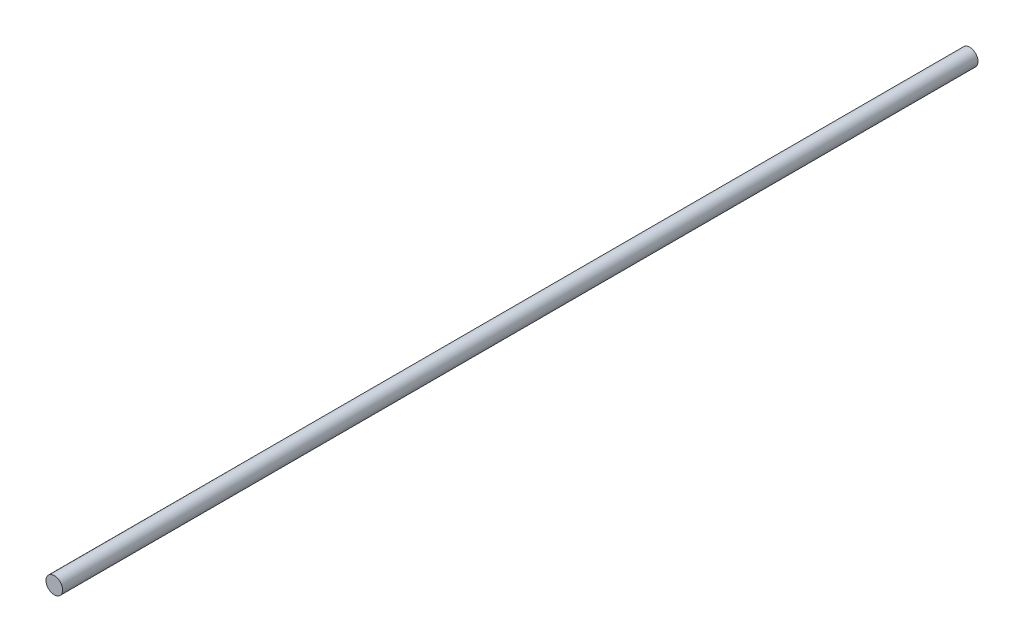
ISO-10303-21;
HEADER;
FILE_DESCRIPTION(('STEP AP214'),'2;1');
FILE_NAME('part.step','',(''),(''),'','','');
FILE_SCHEMA(('AUTOMOTIVE_DESIGN { 1 0 10303 214 1 1 1 1 }'));
ENDSEC;
DATA;
#1=APPLICATION_CONTEXT('core data for automotive mechanical design processes');
#2=APPLICATION_PROTOCOL_DEFINITION('international standard','automotive_design',2000,#1);
#3=PRODUCT_CONTEXT('',#1,'mechanical');
#4=PRODUCT('Part','Part','',(#3));
#5=PRODUCT_RELATED_PRODUCT_CATEGORY('part','',(#4));
#6=PRODUCT_DEFINITION_FORMATION('','',#4);
#7=PRODUCT_DEFINITION_CONTEXT('part definition',#1,'design');
#8=PRODUCT_DEFINITION('design','',#6,#7);
#9=PRODUCT_DEFINITION_SHAPE('','',#8);
#10=(LENGTH_UNIT() NAMED_UNIT(*) SI_UNIT(.MILLI.,.METRE.));
#11=(NAMED_UNIT(*) PLANE_ANGLE_UNIT() SI_UNIT($,.RADIAN.));
#12=(NAMED_UNIT(*) SI_UNIT($,.STERADIAN.) SOLID_ANGLE_UNIT());
#13=UNCERTAINTY_MEASURE_WITH_UNIT(LENGTH_MEASURE(1.E-05),#10,'distance_accuracy_value','');
#14=(GEOMETRIC_REPRESENTATION_CONTEXT(3) GLOBAL_UNCERTAINTY_ASSIGNED_CONTEXT((#13)) GLOBAL_UNIT_ASSIGNED_CONTEXT((#10,
#11,#12)) REPRESENTATION_CONTEXT('',''));
#15=CARTESIAN_POINT('',(0.,0.,0.));
#16=DIRECTION('',(0.,0.,1.));
#17=DIRECTION('',(1.,0.,0.));
#18=AXIS2_PLACEMENT_3D('',#15,#16,#17);
#19=CARTESIAN_POINT('',(0.,0.,330.));
#20=DIRECTION('',(0.,0.,-1.));
#21=DIRECTION('',(-1.,0.,0.));
#22=AXIS2_PLACEMENT_3D('',#19,#20,#21);
#23=CYLINDRICAL_SURFACE('',#22,3.);
#24=CARTESIAN_POINT('',(0.,0.,330.));
#25=DIRECTION('',(0.,0.,1.));
#26=DIRECTION('',(1.,0.,0.));
#27=AXIS2_PLACEMENT_3D('',#24,#25,#26);
#28=CIRCLE('',#27,3.);
#29=CARTESIAN_POINT('',(3.,0.,330.));
#30=VERTEX_POINT('',#29);
#31=EDGE_CURVE('E10',#30,#30,#28,.T.);
#32=ORIENTED_EDGE('',*,*,#31,.F.);
#33=EDGE_LOOP('',(#32));
#34=FACE_BOUND('',#33,.T.);
#35=CARTESIAN_POINT('',(0.,0.,0.));
#36=DIRECTION('',(0.,0.,1.));
#37=DIRECTION('',(1.,0.,0.));
#38=AXIS2_PLACEMENT_3D('',#35,#36,#37);
#39=CIRCLE('',#38,3.);
#40=CARTESIAN_POINT('',(3.,0.,0.));
#41=VERTEX_POINT('',#40);
#42=EDGE_CURVE('E33',#41,#41,#39,.T.);
#43=ORIENTED_EDGE('',*,*,#42,.T.);
#44=EDGE_LOOP('',(#43));
#45=FACE_BOUND('',#44,.T.);
#46=ADVANCED_FACE('F30',(#34,#45),#23,.T.);
#47=CARTESIAN_POINT('',(0.,0.,330.));
#48=DIRECTION('',(0.,0.,1.));
#49=DIRECTION('',(1.,0.,0.));
#50=AXIS2_PLACEMENT_3D('',#47,#48,#49);
#51=PLANE('',#50);
#52=ORIENTED_EDGE('',*,*,#31,.T.);
#53=EDGE_LOOP('',(#52));
#54=FACE_BOUND('',#53,.T.);
#55=ADVANCED_FACE('F45',(#54),#51,.T.);
#56=CARTESIAN_POINT('',(0.,0.,0.));
#57=DIRECTION('',(0.,0.,1.));
#58=DIRECTION('',(1.,0.,0.));
#59=AXIS2_PLACEMENT_3D('',#56,#57,#58);
#60=PLANE('',#59);
#61=ORIENTED_EDGE('',*,*,#42,.F.);
#62=EDGE_LOOP('',(#61));
#63=FACE_BOUND('',#62,.T.);
#64=ADVANCED_FACE('F43',(#63),#60,.F.);
#65=CLOSED_SHELL('',(#46,#55,#64));
#66=MANIFOLD_SOLID_BREP('B2',#65);
#67=ADVANCED_BREP_SHAPE_REPRESENTATION('',(#18,#66),#14);
#68=SHAPE_DEFINITION_REPRESENTATION(#9,#67);
ENDSEC;
END-ISO-10303-21;
